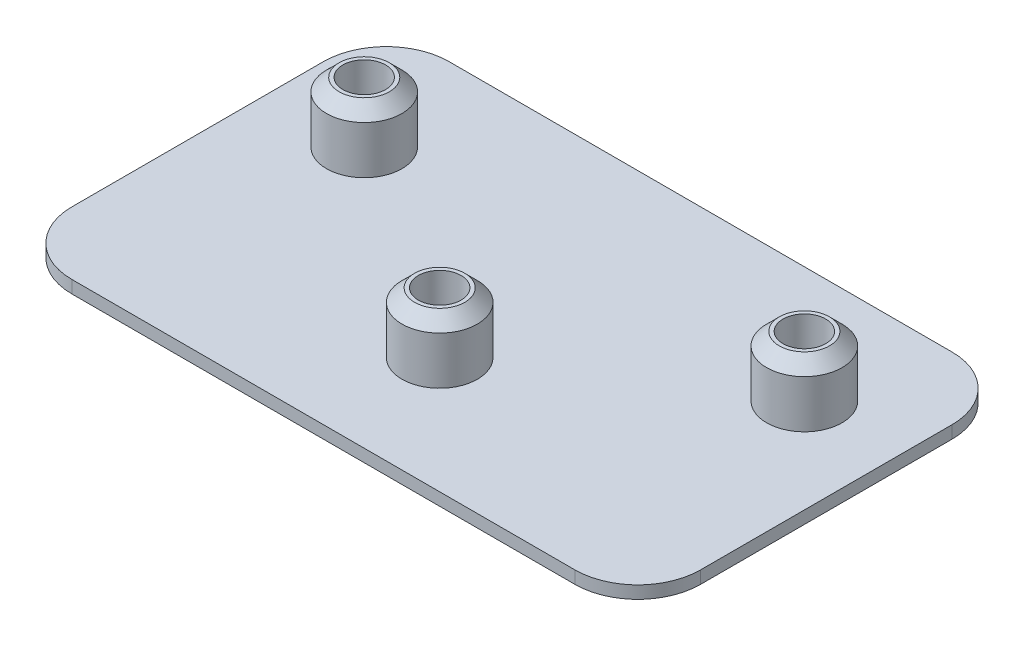
ISO-10303-21;
HEADER;
FILE_DESCRIPTION(('STEP AP214'),'2;1');
FILE_NAME('part.step','',(''),(''),'','','');
FILE_SCHEMA(('AUTOMOTIVE_DESIGN { 1 0 10303 214 1 1 1 1 }'));
ENDSEC;
DATA;
#1=APPLICATION_CONTEXT('core data for automotive mechanical design processes');
#2=APPLICATION_PROTOCOL_DEFINITION('international standard','automotive_design',2000,#1);
#3=PRODUCT_CONTEXT('',#1,'mechanical');
#4=PRODUCT('Part','Part','',(#3));
#5=PRODUCT_RELATED_PRODUCT_CATEGORY('part','',(#4));
#6=PRODUCT_DEFINITION_FORMATION('','',#4);
#7=PRODUCT_DEFINITION_CONTEXT('part definition',#1,'design');
#8=PRODUCT_DEFINITION('design','',#6,#7);
#9=PRODUCT_DEFINITION_SHAPE('','',#8);
#10=(LENGTH_UNIT() NAMED_UNIT(*) SI_UNIT(.MILLI.,.METRE.));
#11=(NAMED_UNIT(*) PLANE_ANGLE_UNIT() SI_UNIT($,.RADIAN.));
#12=(NAMED_UNIT(*) SI_UNIT($,.STERADIAN.) SOLID_ANGLE_UNIT());
#13=UNCERTAINTY_MEASURE_WITH_UNIT(LENGTH_MEASURE(1.E-05),#10,'distance_accuracy_value','');
#14=(GEOMETRIC_REPRESENTATION_CONTEXT(3) GLOBAL_UNCERTAINTY_ASSIGNED_CONTEXT((#13)) GLOBAL_UNIT_ASSIGNED_CONTEXT((#10,
#11,#12)) REPRESENTATION_CONTEXT('',''));
#15=CARTESIAN_POINT('',(0.,0.,0.));
#16=DIRECTION('',(0.,0.,1.));
#17=DIRECTION('',(1.,0.,0.));
#18=AXIS2_PLACEMENT_3D('',#15,#16,#17);
#19=CARTESIAN_POINT('',(-25.,1.,-15.));
#20=DIRECTION('',(1.,0.,0.));
#21=DIRECTION('',(0.,0.,-1.));
#22=AXIS2_PLACEMENT_3D('',#19,#20,#21);
#23=PLANE('',#22);
#24=DIRECTION('',(0.,0.,1.));
#25=VECTOR('',#24,1.);
#26=CARTESIAN_POINT('',(-25.,0.,-15.));
#27=LINE('',#26,#25);
#28=CARTESIAN_POINT('',(-25.,0.,-10.));
#29=VERTEX_POINT('',#28);
#30=CARTESIAN_POINT('',(-25.,0.,10.));
#31=VERTEX_POINT('',#30);
#32=EDGE_CURVE('E142',#29,#31,#27,.T.);
#33=ORIENTED_EDGE('',*,*,#32,.T.);
#34=DIRECTION('',(0.,-1.,0.));
#35=VECTOR('',#34,1.);
#36=CARTESIAN_POINT('',(-25.,1.,10.));
#37=LINE('',#36,#35);
#38=CARTESIAN_POINT('',(-25.,1.,10.));
#39=VERTEX_POINT('',#38);
#40=EDGE_CURVE('E117',#31,#39,#37,.F.);
#41=ORIENTED_EDGE('',*,*,#40,.T.);
#42=DIRECTION('',(0.,0.,1.));
#43=VECTOR('',#42,1.);
#44=CARTESIAN_POINT('',(-25.,1.,-15.));
#45=LINE('',#44,#43);
#46=CARTESIAN_POINT('',(-25.,1.,-10.));
#47=VERTEX_POINT('',#46);
#48=EDGE_CURVE('E155',#47,#39,#45,.T.);
#49=ORIENTED_EDGE('',*,*,#48,.F.);
#50=DIRECTION('',(0.,-1.,0.));
#51=VECTOR('',#50,1.);
#52=CARTESIAN_POINT('',(-25.,0.,-10.));
#53=LINE('',#52,#51);
#54=EDGE_CURVE('E123',#47,#29,#53,.T.);
#55=ORIENTED_EDGE('',*,*,#54,.T.);
#56=EDGE_LOOP('',(#33,#41,#49,#55));
#57=FACE_BOUND('',#56,.T.);
#58=ADVANCED_FACE('F45',(#57),#23,.F.);
#59=CARTESIAN_POINT('',(-25.,1.,15.));
#60=DIRECTION('',(0.,0.,-1.));
#61=DIRECTION('',(-1.,0.,0.));
#62=AXIS2_PLACEMENT_3D('',#59,#60,#61);
#63=PLANE('',#62);
#64=DIRECTION('',(1.,0.,0.));
#65=VECTOR('',#64,1.);
#66=CARTESIAN_POINT('',(-25.,1.,15.));
#67=LINE('',#66,#65);
#68=CARTESIAN_POINT('',(-20.,1.,15.));
#69=VERTEX_POINT('',#68);
#70=CARTESIAN_POINT('',(20.,1.,15.));
#71=VERTEX_POINT('',#70);
#72=EDGE_CURVE('E133',#69,#71,#67,.T.);
#73=ORIENTED_EDGE('',*,*,#72,.F.);
#74=DIRECTION('',(0.,-1.,0.));
#75=VECTOR('',#74,1.);
#76=CARTESIAN_POINT('',(-20.,1.,15.));
#77=LINE('',#76,#75);
#78=CARTESIAN_POINT('',(-20.,0.,15.));
#79=VERTEX_POINT('',#78);
#80=EDGE_CURVE('E116',#69,#79,#77,.T.);
#81=ORIENTED_EDGE('',*,*,#80,.T.);
#82=DIRECTION('',(1.,0.,0.));
#83=VECTOR('',#82,1.);
#84=CARTESIAN_POINT('',(-25.,0.,15.));
#85=LINE('',#84,#83);
#86=CARTESIAN_POINT('',(20.,0.,15.));
#87=VERTEX_POINT('',#86);
#88=EDGE_CURVE('E130',#79,#87,#85,.T.);
#89=ORIENTED_EDGE('',*,*,#88,.T.);
#90=DIRECTION('',(0.,-1.,0.));
#91=VECTOR('',#90,1.);
#92=CARTESIAN_POINT('',(20.,1.,15.));
#93=LINE('',#92,#91);
#94=EDGE_CURVE('E136',#87,#71,#93,.F.);
#95=ORIENTED_EDGE('',*,*,#94,.T.);
#96=EDGE_LOOP('',(#73,#81,#89,#95));
#97=FACE_BOUND('',#96,.T.);
#98=ADVANCED_FACE('F129',(#97),#63,.F.);
#99=CARTESIAN_POINT('',(25.,1.,-15.));
#100=DIRECTION('',(1.,0.,0.));
#101=DIRECTION('',(0.,0.,-1.));
#102=AXIS2_PLACEMENT_3D('',#99,#100,#101);
#103=PLANE('',#102);
#104=DIRECTION('',(0.,0.,1.));
#105=VECTOR('',#104,1.);
#106=CARTESIAN_POINT('',(25.,0.,-15.));
#107=LINE('',#106,#105);
#108=CARTESIAN_POINT('',(25.,0.,-10.));
#109=VERTEX_POINT('',#108);
#110=CARTESIAN_POINT('',(25.,0.,10.));
#111=VERTEX_POINT('',#110);
#112=EDGE_CURVE('E141',#109,#111,#107,.T.);
#113=ORIENTED_EDGE('',*,*,#112,.F.);
#114=DIRECTION('',(0.,-1.,0.));
#115=VECTOR('',#114,1.);
#116=CARTESIAN_POINT('',(25.,1.,-10.));
#117=LINE('',#116,#115);
#118=CARTESIAN_POINT('',(25.,1.,-10.));
#119=VERTEX_POINT('',#118);
#120=EDGE_CURVE('E11',#109,#119,#117,.F.);
#121=ORIENTED_EDGE('',*,*,#120,.T.);
#122=DIRECTION('',(0.,0.,1.));
#123=VECTOR('',#122,1.);
#124=CARTESIAN_POINT('',(25.,1.,-15.));
#125=LINE('',#124,#123);
#126=CARTESIAN_POINT('',(25.,1.,10.));
#127=VERTEX_POINT('',#126);
#128=EDGE_CURVE('E237',#119,#127,#125,.T.);
#129=ORIENTED_EDGE('',*,*,#128,.T.);
#130=DIRECTION('',(0.,-1.,0.));
#131=VECTOR('',#130,1.);
#132=CARTESIAN_POINT('',(25.,0.,10.));
#133=LINE('',#132,#131);
#134=EDGE_CURVE('E54',#127,#111,#133,.T.);
#135=ORIENTED_EDGE('',*,*,#134,.T.);
#136=EDGE_LOOP('',(#113,#121,#129,#135));
#137=FACE_BOUND('',#136,.T.);
#138=ADVANCED_FACE('F235',(#137),#103,.T.);
#139=CARTESIAN_POINT('',(-25.,1.,-15.));
#140=DIRECTION('',(0.,0.,-1.));
#141=DIRECTION('',(-1.,0.,0.));
#142=AXIS2_PLACEMENT_3D('',#139,#140,#141);
#143=PLANE('',#142);
#144=DIRECTION('',(1.,0.,0.));
#145=VECTOR('',#144,1.);
#146=CARTESIAN_POINT('',(-25.,0.,-15.));
#147=LINE('',#146,#145);
#148=CARTESIAN_POINT('',(-20.,0.,-15.));
#149=VERTEX_POINT('',#148);
#150=CARTESIAN_POINT('',(20.,0.,-15.));
#151=VERTEX_POINT('',#150);
#152=EDGE_CURVE('E146',#149,#151,#147,.T.);
#153=ORIENTED_EDGE('',*,*,#152,.F.);
#154=DIRECTION('',(0.,-1.,0.));
#155=VECTOR('',#154,1.);
#156=CARTESIAN_POINT('',(-20.,1.,-15.));
#157=LINE('',#156,#155);
#158=CARTESIAN_POINT('',(-20.,1.,-15.));
#159=VERTEX_POINT('',#158);
#160=EDGE_CURVE('E68',#149,#159,#157,.F.);
#161=ORIENTED_EDGE('',*,*,#160,.T.);
#162=DIRECTION('',(1.,0.,0.));
#163=VECTOR('',#162,1.);
#164=CARTESIAN_POINT('',(-25.,1.,-15.));
#165=LINE('',#164,#163);
#166=CARTESIAN_POINT('',(20.,1.,-15.));
#167=VERTEX_POINT('',#166);
#168=EDGE_CURVE('E179',#159,#167,#165,.T.);
#169=ORIENTED_EDGE('',*,*,#168,.T.);
#170=DIRECTION('',(0.,-1.,0.));
#171=VECTOR('',#170,1.);
#172=CARTESIAN_POINT('',(20.,1.,-15.));
#173=LINE('',#172,#171);
#174=EDGE_CURVE('E224',#167,#151,#173,.T.);
#175=ORIENTED_EDGE('',*,*,#174,.T.);
#176=EDGE_LOOP('',(#153,#161,#169,#175));
#177=FACE_BOUND('',#176,.T.);
#178=ADVANCED_FACE('F243',(#177),#143,.T.);
#179=CARTESIAN_POINT('',(0.,1.,0.));
#180=DIRECTION('',(0.,1.,0.));
#181=DIRECTION('',(0.,0.,1.));
#182=AXIS2_PLACEMENT_3D('',#179,#180,#181);
#183=PLANE('',#182);
#184=CARTESIAN_POINT('',(0.,1.,5.75));
#185=DIRECTION('',(0.,1.,0.));
#186=DIRECTION('',(0.,0.,1.));
#187=AXIS2_PLACEMENT_3D('',#184,#185,#186);
#188=CIRCLE('',#187,3.);
#189=CARTESIAN_POINT('',(0.,1.,8.75));
#190=VERTEX_POINT('',#189);
#191=EDGE_CURVE('E160',#190,#190,#188,.F.);
#192=ORIENTED_EDGE('',*,*,#191,.T.);
#193=EDGE_LOOP('',(#192));
#194=FACE_BOUND('',#193,.T.);
#195=CARTESIAN_POINT('',(17.5,1.,-5.75));
#196=DIRECTION('',(0.,1.,0.));
#197=DIRECTION('',(0.,0.,1.));
#198=AXIS2_PLACEMENT_3D('',#195,#196,#197);
#199=CIRCLE('',#198,3.);
#200=CARTESIAN_POINT('',(17.5,1.,-2.75));
#201=VERTEX_POINT('',#200);
#202=EDGE_CURVE('E257',#201,#201,#199,.F.);
#203=ORIENTED_EDGE('',*,*,#202,.T.);
#204=EDGE_LOOP('',(#203));
#205=FACE_BOUND('',#204,.T.);
#206=CARTESIAN_POINT('',(-17.5,1.,-5.75));
#207=DIRECTION('',(0.,1.,0.));
#208=DIRECTION('',(0.,0.,1.));
#209=AXIS2_PLACEMENT_3D('',#206,#207,#208);
#210=CIRCLE('',#209,3.);
#211=CARTESIAN_POINT('',(-17.5,1.,-2.75));
#212=VERTEX_POINT('',#211);
#213=EDGE_CURVE('E148',#212,#212,#210,.F.);
#214=ORIENTED_EDGE('',*,*,#213,.T.);
#215=EDGE_LOOP('',(#214));
#216=FACE_BOUND('',#215,.T.);
#217=ORIENTED_EDGE('',*,*,#48,.T.);
#218=CARTESIAN_POINT('',(-20.,1.,10.));
#219=DIRECTION('',(0.,1.,0.));
#220=DIRECTION('',(0.,0.,1.));
#221=AXIS2_PLACEMENT_3D('',#218,#219,#220);
#222=CIRCLE('',#221,5.);
#223=EDGE_CURVE('E221',#39,#69,#222,.T.);
#224=ORIENTED_EDGE('',*,*,#223,.T.);
#225=ORIENTED_EDGE('',*,*,#72,.T.);
#226=CARTESIAN_POINT('',(20.,1.,10.));
#227=DIRECTION('',(0.,1.,0.));
#228=DIRECTION('',(0.,0.,1.));
#229=AXIS2_PLACEMENT_3D('',#226,#227,#228);
#230=CIRCLE('',#229,5.);
#231=EDGE_CURVE('E213',#71,#127,#230,.T.);
#232=ORIENTED_EDGE('',*,*,#231,.T.);
#233=ORIENTED_EDGE('',*,*,#128,.F.);
#234=CARTESIAN_POINT('',(20.,1.,-10.));
#235=DIRECTION('',(0.,1.,0.));
#236=DIRECTION('',(0.,0.,1.));
#237=AXIS2_PLACEMENT_3D('',#234,#235,#236);
#238=CIRCLE('',#237,5.);
#239=EDGE_CURVE('E61',#119,#167,#238,.T.);
#240=ORIENTED_EDGE('',*,*,#239,.T.);
#241=ORIENTED_EDGE('',*,*,#168,.F.);
#242=CARTESIAN_POINT('',(-20.,1.,-10.));
#243=DIRECTION('',(0.,1.,0.));
#244=DIRECTION('',(0.,0.,1.));
#245=AXIS2_PLACEMENT_3D('',#242,#243,#244);
#246=CIRCLE('',#245,5.);
#247=EDGE_CURVE('E218',#159,#47,#246,.T.);
#248=ORIENTED_EDGE('',*,*,#247,.T.);
#249=EDGE_LOOP('',(#217,#224,#225,#232,#233,#240,#241,#248));
#250=FACE_BOUND('',#249,.T.);
#251=ADVANCED_FACE('F289',(#194,#205,#216,#250),#183,.T.);
#252=CARTESIAN_POINT('',(0.,0.,0.));
#253=DIRECTION('',(0.,1.,0.));
#254=DIRECTION('',(0.,0.,1.));
#255=AXIS2_PLACEMENT_3D('',#252,#253,#254);
#256=PLANE('',#255);
#257=CARTESIAN_POINT('',(17.5,0.,-5.75));
#258=DIRECTION('',(0.,-1.,0.));
#259=DIRECTION('',(0.,0.,-1.));
#260=AXIS2_PLACEMENT_3D('',#257,#258,#259);
#261=CIRCLE('',#260,3.2);
#262=CARTESIAN_POINT('',(17.5,0.,-8.95));
#263=VERTEX_POINT('',#262);
#264=EDGE_CURVE('E279',#263,#263,#261,.T.);
#265=ORIENTED_EDGE('',*,*,#264,.F.);
#266=EDGE_LOOP('',(#265));
#267=FACE_BOUND('',#266,.T.);
#268=CARTESIAN_POINT('',(0.,0.,5.75));
#269=DIRECTION('',(0.,-1.,0.));
#270=DIRECTION('',(0.,0.,-1.));
#271=AXIS2_PLACEMENT_3D('',#268,#269,#270);
#272=CIRCLE('',#271,3.2);
#273=CARTESIAN_POINT('',(0.,0.,2.55));
#274=VERTEX_POINT('',#273);
#275=EDGE_CURVE('E172',#274,#274,#272,.T.);
#276=ORIENTED_EDGE('',*,*,#275,.F.);
#277=EDGE_LOOP('',(#276));
#278=FACE_BOUND('',#277,.T.);
#279=CARTESIAN_POINT('',(-17.5,0.,-5.75));
#280=DIRECTION('',(0.,-1.,0.));
#281=DIRECTION('',(0.,0.,-1.));
#282=AXIS2_PLACEMENT_3D('',#279,#280,#281);
#283=CIRCLE('',#282,3.2);
#284=CARTESIAN_POINT('',(-17.5,0.,-8.95));
#285=VERTEX_POINT('',#284);
#286=EDGE_CURVE('E166',#285,#285,#283,.T.);
#287=ORIENTED_EDGE('',*,*,#286,.F.);
#288=EDGE_LOOP('',(#287));
#289=FACE_BOUND('',#288,.T.);
#290=ORIENTED_EDGE('',*,*,#88,.F.);
#291=CARTESIAN_POINT('',(-20.,0.,10.));
#292=DIRECTION('',(0.,1.,0.));
#293=DIRECTION('',(0.,0.,1.));
#294=AXIS2_PLACEMENT_3D('',#291,#292,#293);
#295=CIRCLE('',#294,5.);
#296=EDGE_CURVE('E112',#79,#31,#295,.F.);
#297=ORIENTED_EDGE('',*,*,#296,.T.);
#298=ORIENTED_EDGE('',*,*,#32,.F.);
#299=CARTESIAN_POINT('',(-20.,0.,-10.));
#300=DIRECTION('',(0.,1.,0.));
#301=DIRECTION('',(0.,0.,1.));
#302=AXIS2_PLACEMENT_3D('',#299,#300,#301);
#303=CIRCLE('',#302,5.);
#304=EDGE_CURVE('E124',#29,#149,#303,.F.);
#305=ORIENTED_EDGE('',*,*,#304,.T.);
#306=ORIENTED_EDGE('',*,*,#152,.T.);
#307=CARTESIAN_POINT('',(20.,0.,-10.));
#308=DIRECTION('',(0.,1.,0.));
#309=DIRECTION('',(0.,0.,1.));
#310=AXIS2_PLACEMENT_3D('',#307,#308,#309);
#311=CIRCLE('',#310,5.);
#312=EDGE_CURVE('E203',#151,#109,#311,.F.);
#313=ORIENTED_EDGE('',*,*,#312,.T.);
#314=ORIENTED_EDGE('',*,*,#112,.T.);
#315=CARTESIAN_POINT('',(20.,0.,10.));
#316=DIRECTION('',(0.,1.,0.));
#317=DIRECTION('',(0.,0.,1.));
#318=AXIS2_PLACEMENT_3D('',#315,#316,#317);
#319=CIRCLE('',#318,5.);
#320=EDGE_CURVE('E135',#111,#87,#319,.F.);
#321=ORIENTED_EDGE('',*,*,#320,.T.);
#322=EDGE_LOOP('',(#290,#297,#298,#305,#306,#313,#314,#321));
#323=FACE_BOUND('',#322,.T.);
#324=ADVANCED_FACE('F138',(#267,#278,#289,#323),#256,.F.);
#325=CARTESIAN_POINT('',(-17.5,5.8,-5.75));
#326=DIRECTION('',(0.,-1.,0.));
#327=DIRECTION('',(0.,0.,-1.));
#328=AXIS2_PLACEMENT_3D('',#325,#326,#327);
#329=CYLINDRICAL_SURFACE('',#328,3.);
#330=CARTESIAN_POINT('',(-17.5,4.80000000000001,-5.75));
#331=DIRECTION('',(0.,1.,0.));
#332=DIRECTION('',(0.,0.,1.));
#333=AXIS2_PLACEMENT_3D('',#330,#331,#332);
#334=CIRCLE('',#333,3.);
#335=CARTESIAN_POINT('',(-17.5,4.80000000000001,-2.75));
#336=VERTEX_POINT('',#335);
#337=EDGE_CURVE('E178',#336,#336,#334,.F.);
#338=ORIENTED_EDGE('',*,*,#337,.T.);
#339=EDGE_LOOP('',(#338));
#340=FACE_BOUND('',#339,.T.);
#341=ORIENTED_EDGE('',*,*,#213,.F.);
#342=EDGE_LOOP('',(#341));
#343=FACE_BOUND('',#342,.T.);
#344=ADVANCED_FACE('F288',(#340,#343),#329,.T.);
#345=CARTESIAN_POINT('',(-17.5,5.8,-5.75));
#346=DIRECTION('',(0.,1.,0.));
#347=DIRECTION('',(0.,0.,1.));
#348=AXIS2_PLACEMENT_3D('',#345,#346,#347);
#349=PLANE('',#348);
#350=CARTESIAN_POINT('',(-17.5,5.8,-5.75));
#351=DIRECTION('',(0.,1.,0.));
#352=DIRECTION('',(0.,0.,1.));
#353=AXIS2_PLACEMENT_3D('',#350,#351,#352);
#354=CIRCLE('',#353,2.00000000000001);
#355=CARTESIAN_POINT('',(-17.5,5.8,-3.74999999999999));
#356=VERTEX_POINT('',#355);
#357=EDGE_CURVE('E174',#356,#356,#354,.T.);
#358=ORIENTED_EDGE('',*,*,#357,.T.);
#359=EDGE_LOOP('',(#358));
#360=FACE_BOUND('',#359,.T.);
#361=CARTESIAN_POINT('',(-17.5,5.8,-5.75));
#362=DIRECTION('',(0.,1.,0.));
#363=DIRECTION('',(0.,0.,1.));
#364=AXIS2_PLACEMENT_3D('',#361,#362,#363);
#365=CIRCLE('',#364,1.7);
#366=CARTESIAN_POINT('',(-17.5,5.8,-4.05));
#367=VERTEX_POINT('',#366);
#368=EDGE_CURVE('E156',#367,#367,#365,.T.);
#369=ORIENTED_EDGE('',*,*,#368,.F.);
#370=EDGE_LOOP('',(#369));
#371=FACE_BOUND('',#370,.T.);
#372=ADVANCED_FACE('F519',(#360,#371),#349,.T.);
#373=CARTESIAN_POINT('',(17.5,5.8,-5.75));
#374=DIRECTION('',(0.,-1.,0.));
#375=DIRECTION('',(0.,0.,-1.));
#376=AXIS2_PLACEMENT_3D('',#373,#374,#375);
#377=CYLINDRICAL_SURFACE('',#376,3.);
#378=CARTESIAN_POINT('',(17.5,4.8,-5.75));
#379=DIRECTION('',(0.,1.,0.));
#380=DIRECTION('',(0.,0.,1.));
#381=AXIS2_PLACEMENT_3D('',#378,#379,#380);
#382=CIRCLE('',#381,3.);
#383=CARTESIAN_POINT('',(17.5,4.8,-2.75));
#384=VERTEX_POINT('',#383);
#385=EDGE_CURVE('E195',#384,#384,#382,.F.);
#386=ORIENTED_EDGE('',*,*,#385,.T.);
#387=EDGE_LOOP('',(#386));
#388=FACE_BOUND('',#387,.T.);
#389=ORIENTED_EDGE('',*,*,#202,.F.);
#390=EDGE_LOOP('',(#389));
#391=FACE_BOUND('',#390,.T.);
#392=ADVANCED_FACE('F509',(#388,#391),#377,.T.);
#393=CARTESIAN_POINT('',(17.5,5.8,-5.75));
#394=DIRECTION('',(0.,1.,0.));
#395=DIRECTION('',(0.,0.,1.));
#396=AXIS2_PLACEMENT_3D('',#393,#394,#395);
#397=PLANE('',#396);
#398=CARTESIAN_POINT('',(17.5,5.8,-5.75));
#399=DIRECTION('',(0.,1.,0.));
#400=DIRECTION('',(0.,0.,1.));
#401=AXIS2_PLACEMENT_3D('',#398,#399,#400);
#402=CIRCLE('',#401,2.00000000000001);
#403=CARTESIAN_POINT('',(17.5,5.8,-3.74999999999999));
#404=VERTEX_POINT('',#403);
#405=EDGE_CURVE('E191',#404,#404,#402,.T.);
#406=ORIENTED_EDGE('',*,*,#405,.T.);
#407=EDGE_LOOP('',(#406));
#408=FACE_BOUND('',#407,.T.);
#409=CARTESIAN_POINT('',(17.5,5.8,-5.75));
#410=DIRECTION('',(0.,1.,0.));
#411=DIRECTION('',(0.,0.,1.));
#412=AXIS2_PLACEMENT_3D('',#409,#410,#411);
#413=CIRCLE('',#412,1.7);
#414=CARTESIAN_POINT('',(17.5,5.8,-4.05));
#415=VERTEX_POINT('',#414);
#416=EDGE_CURVE('E168',#415,#415,#413,.T.);
#417=ORIENTED_EDGE('',*,*,#416,.F.);
#418=EDGE_LOOP('',(#417));
#419=FACE_BOUND('',#418,.T.);
#420=ADVANCED_FACE('F499',(#408,#419),#397,.T.);
#421=CARTESIAN_POINT('',(0.,5.8,5.75));
#422=DIRECTION('',(0.,-1.,0.));
#423=DIRECTION('',(0.,0.,-1.));
#424=AXIS2_PLACEMENT_3D('',#421,#422,#423);
#425=CYLINDRICAL_SURFACE('',#424,3.);
#426=CARTESIAN_POINT('',(0.,4.8,5.75));
#427=DIRECTION('',(0.,1.,0.));
#428=DIRECTION('',(0.,0.,1.));
#429=AXIS2_PLACEMENT_3D('',#426,#427,#428);
#430=CIRCLE('',#429,3.);
#431=CARTESIAN_POINT('',(0.,4.8,8.75));
#432=VERTEX_POINT('',#431);
#433=EDGE_CURVE('E187',#432,#432,#430,.F.);
#434=ORIENTED_EDGE('',*,*,#433,.T.);
#435=EDGE_LOOP('',(#434));
#436=FACE_BOUND('',#435,.T.);
#437=ORIENTED_EDGE('',*,*,#191,.F.);
#438=EDGE_LOOP('',(#437));
#439=FACE_BOUND('',#438,.T.);
#440=ADVANCED_FACE('F489',(#436,#439),#425,.T.);
#441=CARTESIAN_POINT('',(0.,5.8,5.75));
#442=DIRECTION('',(0.,1.,0.));
#443=DIRECTION('',(0.,0.,1.));
#444=AXIS2_PLACEMENT_3D('',#441,#442,#443);
#445=PLANE('',#444);
#446=CARTESIAN_POINT('',(0.,5.8,5.75));
#447=DIRECTION('',(0.,1.,0.));
#448=DIRECTION('',(0.,0.,1.));
#449=AXIS2_PLACEMENT_3D('',#446,#447,#448);
#450=CIRCLE('',#449,2.00000000000001);
#451=CARTESIAN_POINT('',(0.,5.8,7.75000000000001));
#452=VERTEX_POINT('',#451);
#453=EDGE_CURVE('E183',#452,#452,#450,.T.);
#454=ORIENTED_EDGE('',*,*,#453,.T.);
#455=EDGE_LOOP('',(#454));
#456=FACE_BOUND('',#455,.T.);
#457=CARTESIAN_POINT('',(0.,5.8,5.75));
#458=DIRECTION('',(0.,1.,0.));
#459=DIRECTION('',(0.,0.,1.));
#460=AXIS2_PLACEMENT_3D('',#457,#458,#459);
#461=CIRCLE('',#460,1.7);
#462=CARTESIAN_POINT('',(0.,5.8,7.45));
#463=VERTEX_POINT('',#462);
#464=EDGE_CURVE('E162',#463,#463,#461,.T.);
#465=ORIENTED_EDGE('',*,*,#464,.F.);
#466=EDGE_LOOP('',(#465));
#467=FACE_BOUND('',#466,.T.);
#468=ADVANCED_FACE('F308',(#456,#467),#445,.T.);
#469=CARTESIAN_POINT('',(-17.5,0.,-5.75));
#470=DIRECTION('',(0.,-1.,0.));
#471=DIRECTION('',(0.,0.,-1.));
#472=AXIS2_PLACEMENT_3D('',#469,#470,#471);
#473=CYLINDRICAL_SURFACE('',#472,1.7);
#474=ORIENTED_EDGE('',*,*,#368,.T.);
#475=EDGE_LOOP('',(#474));
#476=FACE_BOUND('',#475,.T.);
#477=CARTESIAN_POINT('',(-17.5,1.5,-5.75));
#478=DIRECTION('',(0.,-1.,0.));
#479=DIRECTION('',(0.,0.,-1.));
#480=AXIS2_PLACEMENT_3D('',#477,#478,#479);
#481=CIRCLE('',#480,1.7);
#482=CARTESIAN_POINT('',(-17.5,1.5,-7.45));
#483=VERTEX_POINT('',#482);
#484=EDGE_CURVE('E161',#483,#483,#481,.T.);
#485=ORIENTED_EDGE('',*,*,#484,.T.);
#486=EDGE_LOOP('',(#485));
#487=FACE_BOUND('',#486,.T.);
#488=ADVANCED_FACE('F298',(#476,#487),#473,.F.);
#489=CARTESIAN_POINT('',(-17.5,0.,-5.75));
#490=DIRECTION('',(0.,-1.,0.));
#491=DIRECTION('',(0.,0.,-1.));
#492=AXIS2_PLACEMENT_3D('',#489,#490,#491);
#493=CONICAL_SURFACE('',#492,3.2,0.785398163397447);
#494=ORIENTED_EDGE('',*,*,#484,.F.);
#495=EDGE_LOOP('',(#494));
#496=FACE_BOUND('',#495,.T.);
#497=ORIENTED_EDGE('',*,*,#286,.T.);
#498=EDGE_LOOP('',(#497));
#499=FACE_BOUND('',#498,.T.);
#500=ADVANCED_FACE('F295',(#496,#499),#493,.F.);
#501=CARTESIAN_POINT('',(0.,0.,5.75));
#502=DIRECTION('',(0.,-1.,0.));
#503=DIRECTION('',(0.,0.,-1.));
#504=AXIS2_PLACEMENT_3D('',#501,#502,#503);
#505=CYLINDRICAL_SURFACE('',#504,1.7);
#506=ORIENTED_EDGE('',*,*,#464,.T.);
#507=EDGE_LOOP('',(#506));
#508=FACE_BOUND('',#507,.T.);
#509=CARTESIAN_POINT('',(0.,1.5,5.75));
#510=DIRECTION('',(0.,-1.,0.));
#511=DIRECTION('',(0.,0.,-1.));
#512=AXIS2_PLACEMENT_3D('',#509,#510,#511);
#513=CIRCLE('',#512,1.7);
#514=CARTESIAN_POINT('',(0.,1.5,4.05));
#515=VERTEX_POINT('',#514);
#516=EDGE_CURVE('E167',#515,#515,#513,.T.);
#517=ORIENTED_EDGE('',*,*,#516,.T.);
#518=EDGE_LOOP('',(#517));
#519=FACE_BOUND('',#518,.T.);
#520=ADVANCED_FACE('F297',(#508,#519),#505,.F.);
#521=CARTESIAN_POINT('',(0.,0.,5.75));
#522=DIRECTION('',(0.,-1.,0.));
#523=DIRECTION('',(0.,0.,-1.));
#524=AXIS2_PLACEMENT_3D('',#521,#522,#523);
#525=CONICAL_SURFACE('',#524,3.2,0.785398163397448);
#526=ORIENTED_EDGE('',*,*,#516,.F.);
#527=EDGE_LOOP('',(#526));
#528=FACE_BOUND('',#527,.T.);
#529=ORIENTED_EDGE('',*,*,#275,.T.);
#530=EDGE_LOOP('',(#529));
#531=FACE_BOUND('',#530,.T.);
#532=ADVANCED_FACE('F305',(#528,#531),#525,.F.);
#533=CARTESIAN_POINT('',(17.5,0.,-5.75));
#534=DIRECTION('',(0.,-1.,0.));
#535=DIRECTION('',(0.,0.,-1.));
#536=AXIS2_PLACEMENT_3D('',#533,#534,#535);
#537=CYLINDRICAL_SURFACE('',#536,1.7);
#538=ORIENTED_EDGE('',*,*,#416,.T.);
#539=EDGE_LOOP('',(#538));
#540=FACE_BOUND('',#539,.T.);
#541=CARTESIAN_POINT('',(17.5,1.5,-5.75));
#542=DIRECTION('',(0.,-1.,0.));
#543=DIRECTION('',(0.,0.,-1.));
#544=AXIS2_PLACEMENT_3D('',#541,#542,#543);
#545=CIRCLE('',#544,1.7);
#546=CARTESIAN_POINT('',(17.5,1.5,-7.45));
#547=VERTEX_POINT('',#546);
#548=EDGE_CURVE('E173',#547,#547,#545,.T.);
#549=ORIENTED_EDGE('',*,*,#548,.T.);
#550=EDGE_LOOP('',(#549));
#551=FACE_BOUND('',#550,.T.);
#552=ADVANCED_FACE('F444',(#540,#551),#537,.F.);
#553=CARTESIAN_POINT('',(17.5,0.,-5.75));
#554=DIRECTION('',(0.,-1.,0.));
#555=DIRECTION('',(0.,0.,-1.));
#556=AXIS2_PLACEMENT_3D('',#553,#554,#555);
#557=CONICAL_SURFACE('',#556,3.2,0.785398163397448);
#558=ORIENTED_EDGE('',*,*,#548,.F.);
#559=EDGE_LOOP('',(#558));
#560=FACE_BOUND('',#559,.T.);
#561=ORIENTED_EDGE('',*,*,#264,.T.);
#562=EDGE_LOOP('',(#561));
#563=FACE_BOUND('',#562,.T.);
#564=ADVANCED_FACE('F284',(#560,#563),#557,.F.);
#565=CARTESIAN_POINT('',(-17.5,5.8,-5.75));
#566=DIRECTION('',(0.,-1.,0.));
#567=DIRECTION('',(0.,0.,-1.));
#568=AXIS2_PLACEMENT_3D('',#565,#566,#567);
#569=CONICAL_SURFACE('',#568,2.00000000000001,0.785398163397447);
#570=ORIENTED_EDGE('',*,*,#337,.F.);
#571=EDGE_LOOP('',(#570));
#572=FACE_BOUND('',#571,.T.);
#573=ORIENTED_EDGE('',*,*,#357,.F.);
#574=EDGE_LOOP('',(#573));
#575=FACE_BOUND('',#574,.T.);
#576=ADVANCED_FACE('F322',(#572,#575),#569,.T.);
#577=CARTESIAN_POINT('',(0.,5.8,5.75));
#578=DIRECTION('',(0.,-1.,0.));
#579=DIRECTION('',(0.,0.,-1.));
#580=AXIS2_PLACEMENT_3D('',#577,#578,#579);
#581=CONICAL_SURFACE('',#580,2.00000000000001,0.785398163397446);
#582=ORIENTED_EDGE('',*,*,#433,.F.);
#583=EDGE_LOOP('',(#582));
#584=FACE_BOUND('',#583,.T.);
#585=ORIENTED_EDGE('',*,*,#453,.F.);
#586=EDGE_LOOP('',(#585));
#587=FACE_BOUND('',#586,.T.);
#588=ADVANCED_FACE('F328',(#584,#587),#581,.T.);
#589=CARTESIAN_POINT('',(17.5,5.8,-5.75));
#590=DIRECTION('',(0.,-1.,0.));
#591=DIRECTION('',(0.,0.,-1.));
#592=AXIS2_PLACEMENT_3D('',#589,#590,#591);
#593=CONICAL_SURFACE('',#592,2.00000000000001,0.785398163397447);
#594=ORIENTED_EDGE('',*,*,#385,.F.);
#595=EDGE_LOOP('',(#594));
#596=FACE_BOUND('',#595,.T.);
#597=ORIENTED_EDGE('',*,*,#405,.F.);
#598=EDGE_LOOP('',(#597));
#599=FACE_BOUND('',#598,.T.);
#600=ADVANCED_FACE('F335',(#596,#599),#593,.T.);
#601=CARTESIAN_POINT('',(-20.,1.,10.));
#602=DIRECTION('',(0.,-1.,0.));
#603=DIRECTION('',(0.,0.,-1.));
#604=AXIS2_PLACEMENT_3D('',#601,#602,#603);
#605=CYLINDRICAL_SURFACE('',#604,5.);
#606=ORIENTED_EDGE('',*,*,#223,.F.);
#607=ORIENTED_EDGE('',*,*,#40,.F.);
#608=ORIENTED_EDGE('',*,*,#296,.F.);
#609=ORIENTED_EDGE('',*,*,#80,.F.);
#610=EDGE_LOOP('',(#606,#607,#608,#609));
#611=FACE_BOUND('',#610,.T.);
#612=ADVANCED_FACE('F115',(#611),#605,.T.);
#613=CARTESIAN_POINT('',(-20.,1.,-10.));
#614=DIRECTION('',(0.,1.,0.));
#615=DIRECTION('',(0.,0.,1.));
#616=AXIS2_PLACEMENT_3D('',#613,#614,#615);
#617=CYLINDRICAL_SURFACE('',#616,5.);
#618=ORIENTED_EDGE('',*,*,#247,.F.);
#619=ORIENTED_EDGE('',*,*,#160,.F.);
#620=ORIENTED_EDGE('',*,*,#304,.F.);
#621=ORIENTED_EDGE('',*,*,#54,.F.);
#622=EDGE_LOOP('',(#618,#619,#620,#621));
#623=FACE_BOUND('',#622,.T.);
#624=ADVANCED_FACE('F344',(#623),#617,.T.);
#625=CARTESIAN_POINT('',(20.,1.,-10.));
#626=DIRECTION('',(0.,-1.,0.));
#627=DIRECTION('',(0.,0.,-1.));
#628=AXIS2_PLACEMENT_3D('',#625,#626,#627);
#629=CYLINDRICAL_SURFACE('',#628,5.);
#630=ORIENTED_EDGE('',*,*,#239,.F.);
#631=ORIENTED_EDGE('',*,*,#120,.F.);
#632=ORIENTED_EDGE('',*,*,#312,.F.);
#633=ORIENTED_EDGE('',*,*,#174,.F.);
#634=EDGE_LOOP('',(#630,#631,#632,#633));
#635=FACE_BOUND('',#634,.T.);
#636=ADVANCED_FACE('F242',(#635),#629,.T.);
#637=CARTESIAN_POINT('',(20.,1.,10.));
#638=DIRECTION('',(0.,1.,0.));
#639=DIRECTION('',(0.,0.,1.));
#640=AXIS2_PLACEMENT_3D('',#637,#638,#639);
#641=CYLINDRICAL_SURFACE('',#640,5.);
#642=ORIENTED_EDGE('',*,*,#231,.F.);
#643=ORIENTED_EDGE('',*,*,#94,.F.);
#644=ORIENTED_EDGE('',*,*,#320,.F.);
#645=ORIENTED_EDGE('',*,*,#134,.F.);
#646=EDGE_LOOP('',(#642,#643,#644,#645));
#647=FACE_BOUND('',#646,.T.);
#648=ADVANCED_FACE('F47',(#647),#641,.T.);
#649=CLOSED_SHELL('',(#58,#98,#138,#178,#251,#324,#344,#372,#392,#420,#440,#468,#488,#500,#520,
#532,#552,#564,#576,#588,#600,#612,#624,#636,#648));
#650=MANIFOLD_SOLID_BREP('B2',#649);
#651=ADVANCED_BREP_SHAPE_REPRESENTATION('',(#18,#650),#14);
#652=SHAPE_DEFINITION_REPRESENTATION(#9,#651);
ENDSEC;
END-ISO-10303-21;
